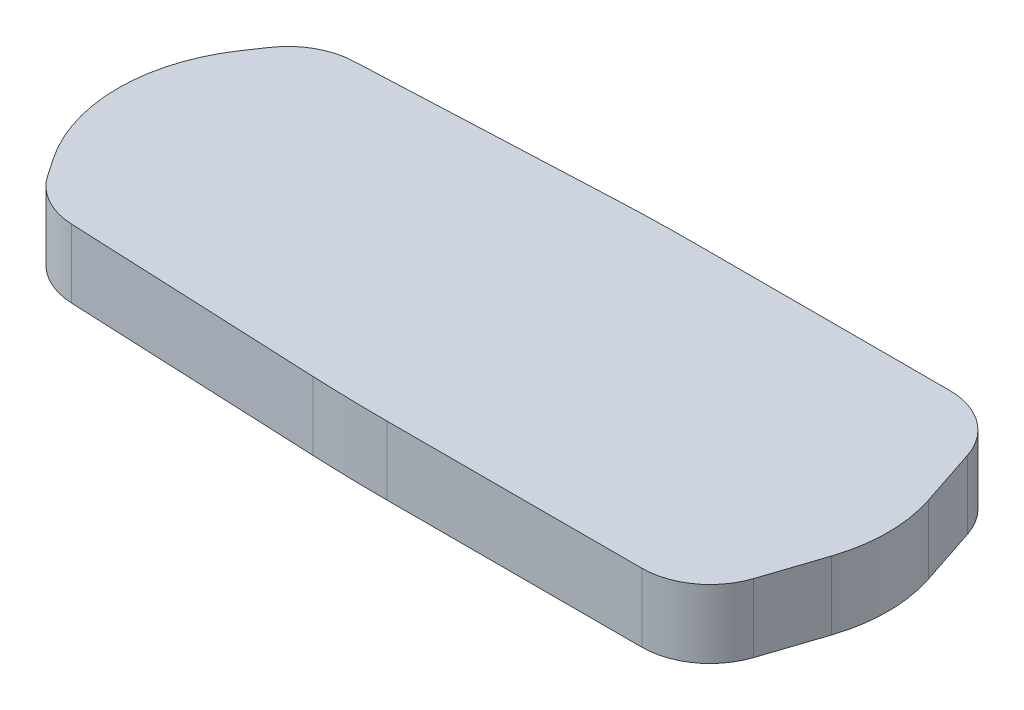
ISO-10303-21;
HEADER;
FILE_DESCRIPTION(('STEP AP214'),'2;1');
FILE_NAME('part.step','',(''),(''),'','','');
FILE_SCHEMA(('AUTOMOTIVE_DESIGN { 1 0 10303 214 1 1 1 1 }'));
ENDSEC;
DATA;
#1=APPLICATION_CONTEXT('core data for automotive mechanical design processes');
#2=APPLICATION_PROTOCOL_DEFINITION('international standard','automotive_design',2000,#1);
#3=PRODUCT_CONTEXT('',#1,'mechanical');
#4=PRODUCT('Part','Part','',(#3));
#5=PRODUCT_RELATED_PRODUCT_CATEGORY('part','',(#4));
#6=PRODUCT_DEFINITION_FORMATION('','',#4);
#7=PRODUCT_DEFINITION_CONTEXT('part definition',#1,'design');
#8=PRODUCT_DEFINITION('design','',#6,#7);
#9=PRODUCT_DEFINITION_SHAPE('','',#8);
#10=(LENGTH_UNIT() NAMED_UNIT(*) SI_UNIT(.MILLI.,.METRE.));
#11=(NAMED_UNIT(*) PLANE_ANGLE_UNIT() SI_UNIT($,.RADIAN.));
#12=(NAMED_UNIT(*) SI_UNIT($,.STERADIAN.) SOLID_ANGLE_UNIT());
#13=UNCERTAINTY_MEASURE_WITH_UNIT(LENGTH_MEASURE(1.E-05),#10,'distance_accuracy_value','');
#14=(GEOMETRIC_REPRESENTATION_CONTEXT(3) GLOBAL_UNCERTAINTY_ASSIGNED_CONTEXT((#13)) GLOBAL_UNIT_ASSIGNED_CONTEXT((#10,
#11,#12)) REPRESENTATION_CONTEXT('',''));
#15=CARTESIAN_POINT('',(0.,0.,0.));
#16=DIRECTION('',(0.,0.,1.));
#17=DIRECTION('',(1.,0.,0.));
#18=AXIS2_PLACEMENT_3D('',#15,#16,#17);
#19=CARTESIAN_POINT('',(247.211259110415,40.,910.));
#20=DIRECTION('',(0.,-1.,0.));
#21=DIRECTION('',(0.,0.,-1.));
#22=AXIS2_PLACEMENT_3D('',#19,#20,#21);
#23=CYLINDRICAL_SURFACE('',#22,1000.);
#24=CARTESIAN_POINT('',(247.211259110415,0.,910.));
#25=DIRECTION('',(0.,1.,0.));
#26=DIRECTION('',(0.,0.,1.));
#27=AXIS2_PLACEMENT_3D('',#24,#25,#26);
#28=CIRCLE('',#27,1000.);
#29=CARTESIAN_POINT('',(247.21125911042,0.,-90.));
#30=VERTEX_POINT('',#29);
#31=CARTESIAN_POINT('',(202.810645489692,0.,-89.0138064662085));
#32=VERTEX_POINT('',#31);
#33=EDGE_CURVE('E177',#30,#32,#28,.T.);
#34=ORIENTED_EDGE('',*,*,#33,.T.);
#35=DIRECTION('',(0.,-1.,0.));
#36=VECTOR('',#35,1.);
#37=CARTESIAN_POINT('',(202.810645489692,40.,-89.0138064662085));
#38=LINE('',#37,#36);
#39=CARTESIAN_POINT('',(202.810645489692,40.,-89.0138064662085));
#40=VERTEX_POINT('',#39);
#41=EDGE_CURVE('E11',#40,#32,#38,.T.);
#42=ORIENTED_EDGE('',*,*,#41,.F.);
#43=CARTESIAN_POINT('',(247.211259110415,40.,910.));
#44=DIRECTION('',(0.,1.,0.));
#45=DIRECTION('',(0.,0.,1.));
#46=AXIS2_PLACEMENT_3D('',#43,#44,#45);
#47=CIRCLE('',#46,1000.);
#48=CARTESIAN_POINT('',(247.21125911042,40.,-90.));
#49=VERTEX_POINT('',#48);
#50=EDGE_CURVE('E207',#49,#40,#47,.T.);
#51=ORIENTED_EDGE('',*,*,#50,.F.);
#52=DIRECTION('',(0.,-1.,0.));
#53=VECTOR('',#52,1.);
#54=CARTESIAN_POINT('',(247.21125911042,40.,-90.));
#55=LINE('',#54,#53);
#56=EDGE_CURVE('E173',#49,#30,#55,.T.);
#57=ORIENTED_EDGE('',*,*,#56,.T.);
#58=EDGE_LOOP('',(#34,#42,#51,#57));
#59=FACE_BOUND('',#58,.T.);
#60=ADVANCED_FACE('F33',(#59),#23,.T.);
#61=CARTESIAN_POINT('',(55.0607586994908,40.,-82.4471448310885));
#62=DIRECTION('',(0.0444006136207204,0.,0.999013806466209));
#63=DIRECTION('',(0.999013806466209,0.,-0.0444006136207204));
#64=AXIS2_PLACEMENT_3D('',#61,#62,#63);
#65=PLANE('',#64);
#66=DIRECTION('',(-0.999013806466209,0.,0.0444006136207204));
#67=VECTOR('',#66,1.);
#68=CARTESIAN_POINT('',(55.0607586994908,0.,-82.4471448310885));
#69=LINE('',#68,#67);
#70=CARTESIAN_POINT('',(55.0607586994908,0.,-82.4471448310885));
#71=VERTEX_POINT('',#70);
#72=EDGE_CURVE('E180',#32,#71,#69,.T.);
#73=ORIENTED_EDGE('',*,*,#72,.T.);
#74=DIRECTION('',(0.,-1.,0.));
#75=VECTOR('',#74,1.);
#76=CARTESIAN_POINT('',(55.0607586994908,40.,-82.4471448310885));
#77=LINE('',#76,#75);
#78=CARTESIAN_POINT('',(55.0607586994908,40.,-82.4471448310885));
#79=VERTEX_POINT('',#78);
#80=EDGE_CURVE('E41',#79,#71,#77,.T.);
#81=ORIENTED_EDGE('',*,*,#80,.F.);
#82=DIRECTION('',(-0.999013806466209,0.,0.0444006136207204));
#83=VECTOR('',#82,1.);
#84=CARTESIAN_POINT('',(55.0607586994908,40.,-82.4471448310885));
#85=LINE('',#84,#83);
#86=EDGE_CURVE('E116',#40,#79,#85,.T.);
#87=ORIENTED_EDGE('',*,*,#86,.F.);
#88=ORIENTED_EDGE('',*,*,#41,.T.);
#89=EDGE_LOOP('',(#73,#81,#87,#88));
#90=FACE_BOUND('',#89,.T.);
#91=ADVANCED_FACE('F305',(#90),#65,.F.);
#92=CARTESIAN_POINT('',(56.8367832443194,40.,-42.4865925724401));
#93=DIRECTION('',(0.,-1.,0.));
#94=DIRECTION('',(0.,0.,-1.));
#95=AXIS2_PLACEMENT_3D('',#92,#93,#94);
#96=CYLINDRICAL_SURFACE('',#95,40.);
#97=CARTESIAN_POINT('',(56.8367832443194,0.,-42.4865925724401));
#98=DIRECTION('',(0.,1.,0.));
#99=DIRECTION('',(0.,0.,-1.));
#100=AXIS2_PLACEMENT_3D('',#97,#98,#99);
#101=CIRCLE('',#100,40.);
#102=CARTESIAN_POINT('',(23.7302719471752,0.,-64.9356217214269));
#103=VERTEX_POINT('',#102);
#104=EDGE_CURVE('E182',#71,#103,#101,.T.);
#105=ORIENTED_EDGE('',*,*,#104,.T.);
#106=DIRECTION('',(0.,-1.,0.));
#107=VECTOR('',#106,1.);
#108=CARTESIAN_POINT('',(23.7302719471752,40.,-64.9356217214269));
#109=LINE('',#108,#107);
#110=CARTESIAN_POINT('',(23.7302719471752,40.,-64.9356217214269));
#111=VERTEX_POINT('',#110);
#112=EDGE_CURVE('E238',#111,#103,#109,.T.);
#113=ORIENTED_EDGE('',*,*,#112,.F.);
#114=CARTESIAN_POINT('',(56.8367832443194,40.,-42.4865925724401));
#115=DIRECTION('',(0.,1.,0.));
#116=DIRECTION('',(0.,0.,-1.));
#117=AXIS2_PLACEMENT_3D('',#114,#115,#116);
#118=CIRCLE('',#117,40.);
#119=EDGE_CURVE('E246',#79,#111,#118,.T.);
#120=ORIENTED_EDGE('',*,*,#119,.F.);
#121=ORIENTED_EDGE('',*,*,#80,.T.);
#122=EDGE_LOOP('',(#105,#113,#120,#121));
#123=FACE_BOUND('',#122,.T.);
#124=ADVANCED_FACE('F244',(#123),#96,.T.);
#125=CARTESIAN_POINT('',(16.802878713211,40.,-54.7195085506556));
#126=DIRECTION('',(0.827662782428605,0.,0.561225728724673));
#127=DIRECTION('',(0.561225728724673,0.,-0.827662782428605));
#128=AXIS2_PLACEMENT_3D('',#125,#126,#127);
#129=PLANE('',#128);
#130=DIRECTION('',(-0.561225728724673,0.,0.827662782428605));
#131=VECTOR('',#130,1.);
#132=CARTESIAN_POINT('',(16.802878713211,0.,-54.7195085506556));
#133=LINE('',#132,#131);
#134=CARTESIAN_POINT('',(16.802878713211,0.,-54.7195085506556));
#135=VERTEX_POINT('',#134);
#136=EDGE_CURVE('E184',#103,#135,#133,.T.);
#137=ORIENTED_EDGE('',*,*,#136,.T.);
#138=DIRECTION('',(0.,-1.,0.));
#139=VECTOR('',#138,1.);
#140=CARTESIAN_POINT('',(16.802878713211,40.,-54.7195085506556));
#141=LINE('',#140,#139);
#142=CARTESIAN_POINT('',(16.802878713211,40.,-54.7195085506556));
#143=VERTEX_POINT('',#142);
#144=EDGE_CURVE('E235',#143,#135,#141,.T.);
#145=ORIENTED_EDGE('',*,*,#144,.F.);
#146=DIRECTION('',(-0.561225728724673,0.,0.827662782428605));
#147=VECTOR('',#146,1.);
#148=CARTESIAN_POINT('',(16.802878713211,40.,-54.7195085506556));
#149=LINE('',#148,#147);
#150=EDGE_CURVE('E264',#111,#143,#149,.T.);
#151=ORIENTED_EDGE('',*,*,#150,.F.);
#152=ORIENTED_EDGE('',*,*,#112,.T.);
#153=EDGE_LOOP('',(#137,#145,#151,#152));
#154=FACE_BOUND('',#153,.T.);
#155=ADVANCED_FACE('F255',(#154),#129,.F.);
#156=CARTESIAN_POINT('',(97.5,40.,0.));
#157=DIRECTION('',(0.,-1.,0.));
#158=DIRECTION('',(0.,0.,-1.));
#159=AXIS2_PLACEMENT_3D('',#156,#157,#158);
#160=CYLINDRICAL_SURFACE('',#159,97.5);
#161=CARTESIAN_POINT('',(97.5,0.,0.));
#162=DIRECTION('',(0.,1.,0.));
#163=DIRECTION('',(0.,0.,1.));
#164=AXIS2_PLACEMENT_3D('',#161,#162,#163);
#165=CIRCLE('',#164,97.5);
#166=CARTESIAN_POINT('',(16.802878713211,0.,54.7195085506556));
#167=VERTEX_POINT('',#166);
#168=EDGE_CURVE('E186',#135,#167,#165,.T.);
#169=ORIENTED_EDGE('',*,*,#168,.T.);
#170=DIRECTION('',(0.,-1.,0.));
#171=VECTOR('',#170,1.);
#172=CARTESIAN_POINT('',(16.802878713211,40.,54.7195085506556));
#173=LINE('',#172,#171);
#174=CARTESIAN_POINT('',(16.802878713211,40.,54.7195085506556));
#175=VERTEX_POINT('',#174);
#176=EDGE_CURVE('E232',#175,#167,#173,.T.);
#177=ORIENTED_EDGE('',*,*,#176,.F.);
#178=CARTESIAN_POINT('',(97.5,40.,0.));
#179=DIRECTION('',(0.,1.,0.));
#180=DIRECTION('',(0.,0.,1.));
#181=AXIS2_PLACEMENT_3D('',#178,#179,#180);
#182=CIRCLE('',#181,97.5);
#183=EDGE_CURVE('E261',#143,#175,#182,.T.);
#184=ORIENTED_EDGE('',*,*,#183,.F.);
#185=ORIENTED_EDGE('',*,*,#144,.T.);
#186=EDGE_LOOP('',(#169,#177,#184,#185));
#187=FACE_BOUND('',#186,.T.);
#188=ADVANCED_FACE('F259',(#187),#160,.T.);
#189=CARTESIAN_POINT('',(16.802878713211,40.,54.7195085506556));
#190=DIRECTION('',(0.827662782428605,0.,-0.561225728724673));
#191=DIRECTION('',(-0.561225728724673,0.,-0.827662782428605));
#192=AXIS2_PLACEMENT_3D('',#189,#190,#191);
#193=PLANE('',#192);
#194=DIRECTION('',(0.561225728724673,0.,0.827662782428605));
#195=VECTOR('',#194,1.);
#196=CARTESIAN_POINT('',(16.802878713211,0.,54.7195085506556));
#197=LINE('',#196,#195);
#198=CARTESIAN_POINT('',(23.7302719471752,0.,64.9356217214269));
#199=VERTEX_POINT('',#198);
#200=EDGE_CURVE('E188',#167,#199,#197,.T.);
#201=ORIENTED_EDGE('',*,*,#200,.T.);
#202=DIRECTION('',(0.,-1.,0.));
#203=VECTOR('',#202,1.);
#204=CARTESIAN_POINT('',(23.7302719471752,40.,64.9356217214269));
#205=LINE('',#204,#203);
#206=CARTESIAN_POINT('',(23.7302719471752,40.,64.9356217214269));
#207=VERTEX_POINT('',#206);
#208=EDGE_CURVE('E229',#207,#199,#205,.T.);
#209=ORIENTED_EDGE('',*,*,#208,.F.);
#210=DIRECTION('',(0.561225728724673,0.,0.827662782428605));
#211=VECTOR('',#210,1.);
#212=CARTESIAN_POINT('',(16.802878713211,40.,54.7195085506556));
#213=LINE('',#212,#211);
#214=EDGE_CURVE('E263',#175,#207,#213,.T.);
#215=ORIENTED_EDGE('',*,*,#214,.F.);
#216=ORIENTED_EDGE('',*,*,#176,.T.);
#217=EDGE_LOOP('',(#201,#209,#215,#216));
#218=FACE_BOUND('',#217,.T.);
#219=ADVANCED_FACE('F318',(#218),#193,.F.);
#220=CARTESIAN_POINT('',(56.8367832443194,40.,42.4865925724401));
#221=DIRECTION('',(0.,-1.,0.));
#222=DIRECTION('',(0.,0.,-1.));
#223=AXIS2_PLACEMENT_3D('',#220,#221,#222);
#224=CYLINDRICAL_SURFACE('',#223,40.);
#225=CARTESIAN_POINT('',(56.8367832443194,0.,42.4865925724401));
#226=DIRECTION('',(0.,1.,0.));
#227=DIRECTION('',(0.,0.,1.));
#228=AXIS2_PLACEMENT_3D('',#225,#226,#227);
#229=CIRCLE('',#228,40.);
#230=CARTESIAN_POINT('',(55.0607586994908,0.,82.4471448310885));
#231=VERTEX_POINT('',#230);
#232=EDGE_CURVE('E190',#199,#231,#229,.T.);
#233=ORIENTED_EDGE('',*,*,#232,.T.);
#234=DIRECTION('',(0.,-1.,0.));
#235=VECTOR('',#234,1.);
#236=CARTESIAN_POINT('',(55.0607586994908,40.,82.4471448310885));
#237=LINE('',#236,#235);
#238=CARTESIAN_POINT('',(55.0607586994908,40.,82.4471448310885));
#239=VERTEX_POINT('',#238);
#240=EDGE_CURVE('E226',#239,#231,#237,.T.);
#241=ORIENTED_EDGE('',*,*,#240,.F.);
#242=CARTESIAN_POINT('',(56.8367832443194,40.,42.4865925724401));
#243=DIRECTION('',(0.,1.,0.));
#244=DIRECTION('',(0.,0.,1.));
#245=AXIS2_PLACEMENT_3D('',#242,#243,#244);
#246=CIRCLE('',#245,40.);
#247=EDGE_CURVE('E266',#207,#239,#246,.T.);
#248=ORIENTED_EDGE('',*,*,#247,.F.);
#249=ORIENTED_EDGE('',*,*,#208,.T.);
#250=EDGE_LOOP('',(#233,#241,#248,#249));
#251=FACE_BOUND('',#250,.T.);
#252=ADVANCED_FACE('F321',(#251),#224,.T.);
#253=CARTESIAN_POINT('',(55.0607586994908,40.,82.4471448310885));
#254=DIRECTION('',(0.0444006136207204,0.,-0.999013806466209));
#255=DIRECTION('',(-0.999013806466209,0.,-0.0444006136207204));
#256=AXIS2_PLACEMENT_3D('',#253,#254,#255);
#257=PLANE('',#256);
#258=DIRECTION('',(0.999013806466209,0.,0.0444006136207204));
#259=VECTOR('',#258,1.);
#260=CARTESIAN_POINT('',(55.0607586994908,0.,82.4471448310885));
#261=LINE('',#260,#259);
#262=CARTESIAN_POINT('',(202.810645489692,0.,89.0138064662086));
#263=VERTEX_POINT('',#262);
#264=EDGE_CURVE('E192',#231,#263,#261,.T.);
#265=ORIENTED_EDGE('',*,*,#264,.T.);
#266=DIRECTION('',(0.,-1.,0.));
#267=VECTOR('',#266,1.);
#268=CARTESIAN_POINT('',(202.810645489692,40.,89.0138064662086));
#269=LINE('',#268,#267);
#270=CARTESIAN_POINT('',(202.810645489692,40.,89.0138064662086));
#271=VERTEX_POINT('',#270);
#272=EDGE_CURVE('E223',#271,#263,#269,.T.);
#273=ORIENTED_EDGE('',*,*,#272,.F.);
#274=DIRECTION('',(0.999013806466209,0.,0.0444006136207204));
#275=VECTOR('',#274,1.);
#276=CARTESIAN_POINT('',(55.0607586994908,40.,82.4471448310885));
#277=LINE('',#276,#275);
#278=EDGE_CURVE('E272',#239,#271,#277,.T.);
#279=ORIENTED_EDGE('',*,*,#278,.F.);
#280=ORIENTED_EDGE('',*,*,#240,.T.);
#281=EDGE_LOOP('',(#265,#273,#279,#280));
#282=FACE_BOUND('',#281,.T.);
#283=ADVANCED_FACE('F325',(#282),#257,.F.);
#284=CARTESIAN_POINT('',(247.211259110415,40.,-910.));
#285=DIRECTION('',(0.,-1.,0.));
#286=DIRECTION('',(0.,0.,-1.));
#287=AXIS2_PLACEMENT_3D('',#284,#285,#286);
#288=CYLINDRICAL_SURFACE('',#287,1000.);
#289=CARTESIAN_POINT('',(247.211259110415,0.,-910.));
#290=DIRECTION('',(0.,1.,0.));
#291=DIRECTION('',(0.,0.,-1.));
#292=AXIS2_PLACEMENT_3D('',#289,#290,#291);
#293=CIRCLE('',#292,1000.);
#294=CARTESIAN_POINT('',(247.21125911042,0.,90.));
#295=VERTEX_POINT('',#294);
#296=EDGE_CURVE('E194',#263,#295,#293,.T.);
#297=ORIENTED_EDGE('',*,*,#296,.T.);
#298=DIRECTION('',(0.,-1.,0.));
#299=VECTOR('',#298,1.);
#300=CARTESIAN_POINT('',(247.21125911042,40.,90.));
#301=LINE('',#300,#299);
#302=CARTESIAN_POINT('',(247.21125911042,40.,90.));
#303=VERTEX_POINT('',#302);
#304=EDGE_CURVE('E220',#303,#295,#301,.T.);
#305=ORIENTED_EDGE('',*,*,#304,.F.);
#306=CARTESIAN_POINT('',(247.211259110415,40.,-910.));
#307=DIRECTION('',(0.,1.,0.));
#308=DIRECTION('',(0.,0.,-1.));
#309=AXIS2_PLACEMENT_3D('',#306,#307,#308);
#310=CIRCLE('',#309,1000.);
#311=EDGE_CURVE('E274',#271,#303,#310,.T.);
#312=ORIENTED_EDGE('',*,*,#311,.F.);
#313=ORIENTED_EDGE('',*,*,#272,.T.);
#314=EDGE_LOOP('',(#297,#305,#312,#313));
#315=FACE_BOUND('',#314,.T.);
#316=ADVANCED_FACE('F329',(#315),#288,.T.);
#317=CARTESIAN_POINT('',(247.21125911042,40.,90.));
#318=DIRECTION('',(0.,0.,-1.));
#319=DIRECTION('',(-1.,0.,0.));
#320=AXIS2_PLACEMENT_3D('',#317,#318,#319);
#321=PLANE('',#320);
#322=DIRECTION('',(1.,0.,0.));
#323=VECTOR('',#322,1.);
#324=CARTESIAN_POINT('',(247.21125911042,0.,90.));
#325=LINE('',#324,#323);
#326=CARTESIAN_POINT('',(396.111111111111,0.,90.));
#327=VERTEX_POINT('',#326);
#328=EDGE_CURVE('E196',#295,#327,#325,.T.);
#329=ORIENTED_EDGE('',*,*,#328,.T.);
#330=DIRECTION('',(0.,-1.,0.));
#331=VECTOR('',#330,1.);
#332=CARTESIAN_POINT('',(396.111111111111,40.,90.));
#333=LINE('',#332,#331);
#334=CARTESIAN_POINT('',(396.111111111111,40.,90.));
#335=VERTEX_POINT('',#334);
#336=EDGE_CURVE('E217',#335,#327,#333,.T.);
#337=ORIENTED_EDGE('',*,*,#336,.F.);
#338=DIRECTION('',(1.,0.,0.));
#339=VECTOR('',#338,1.);
#340=CARTESIAN_POINT('',(247.21125911042,40.,90.));
#341=LINE('',#340,#339);
#342=EDGE_CURVE('E276',#303,#335,#341,.T.);
#343=ORIENTED_EDGE('',*,*,#342,.F.);
#344=ORIENTED_EDGE('',*,*,#304,.T.);
#345=EDGE_LOOP('',(#329,#337,#343,#344));
#346=FACE_BOUND('',#345,.T.);
#347=ADVANCED_FACE('F333',(#346),#321,.F.);
#348=CARTESIAN_POINT('',(396.111111111111,40.,50.));
#349=DIRECTION('',(0.,-1.,0.));
#350=DIRECTION('',(0.,0.,-1.));
#351=AXIS2_PLACEMENT_3D('',#348,#349,#350);
#352=CYLINDRICAL_SURFACE('',#351,40.);
#353=CARTESIAN_POINT('',(396.111111111111,0.,50.));
#354=DIRECTION('',(0.,1.,0.));
#355=DIRECTION('',(0.,0.,1.));
#356=AXIS2_PLACEMENT_3D('',#353,#354,#355);
#357=CIRCLE('',#356,40.);
#358=CARTESIAN_POINT('',(434.082713545188,0.,62.5760649087219));
#359=VERTEX_POINT('',#358);
#360=EDGE_CURVE('E198',#327,#359,#357,.T.);
#361=ORIENTED_EDGE('',*,*,#360,.T.);
#362=DIRECTION('',(0.,-1.,0.));
#363=VECTOR('',#362,1.);
#364=CARTESIAN_POINT('',(434.082713545188,40.,62.5760649087219));
#365=LINE('',#364,#363);
#366=CARTESIAN_POINT('',(434.082713545188,40.,62.5760649087219));
#367=VERTEX_POINT('',#366);
#368=EDGE_CURVE('E214',#367,#359,#365,.T.);
#369=ORIENTED_EDGE('',*,*,#368,.F.);
#370=CARTESIAN_POINT('',(396.111111111111,40.,50.));
#371=DIRECTION('',(0.,1.,0.));
#372=DIRECTION('',(0.,0.,1.));
#373=AXIS2_PLACEMENT_3D('',#370,#371,#372);
#374=CIRCLE('',#373,40.);
#375=EDGE_CURVE('E278',#335,#367,#374,.T.);
#376=ORIENTED_EDGE('',*,*,#375,.F.);
#377=ORIENTED_EDGE('',*,*,#336,.T.);
#378=EDGE_LOOP('',(#361,#369,#376,#377));
#379=FACE_BOUND('',#378,.T.);
#380=ADVANCED_FACE('F337',(#379),#352,.T.);
#381=CARTESIAN_POINT('',(445.436105476673,40.,28.2961460446247));
#382=DIRECTION('',(-0.949290060851927,0.,-0.314401622718054));
#383=DIRECTION('',(-0.314401622718054,0.,0.949290060851927));
#384=AXIS2_PLACEMENT_3D('',#381,#382,#383);
#385=PLANE('',#384);
#386=DIRECTION('',(0.314401622718054,0.,-0.949290060851927));
#387=VECTOR('',#386,1.);
#388=CARTESIAN_POINT('',(445.436105476673,0.,28.2961460446247));
#389=LINE('',#388,#387);
#390=CARTESIAN_POINT('',(445.436105476673,0.,28.2961460446247));
#391=VERTEX_POINT('',#390);
#392=EDGE_CURVE('E200',#359,#391,#389,.T.);
#393=ORIENTED_EDGE('',*,*,#392,.T.);
#394=DIRECTION('',(0.,-1.,0.));
#395=VECTOR('',#394,1.);
#396=CARTESIAN_POINT('',(445.436105476673,40.,28.2961460446247));
#397=LINE('',#396,#395);
#398=CARTESIAN_POINT('',(445.436105476673,40.,28.2961460446247));
#399=VERTEX_POINT('',#398);
#400=EDGE_CURVE('E211',#399,#391,#397,.T.);
#401=ORIENTED_EDGE('',*,*,#400,.F.);
#402=DIRECTION('',(0.314401622718054,0.,-0.949290060851927));
#403=VECTOR('',#402,1.);
#404=CARTESIAN_POINT('',(445.436105476673,40.,28.2961460446247));
#405=LINE('',#404,#403);
#406=EDGE_CURVE('E280',#367,#399,#405,.T.);
#407=ORIENTED_EDGE('',*,*,#406,.F.);
#408=ORIENTED_EDGE('',*,*,#368,.T.);
#409=EDGE_LOOP('',(#393,#401,#407,#408));
#410=FACE_BOUND('',#409,.T.);
#411=ADVANCED_FACE('F286',(#410),#385,.F.);
#412=CARTESIAN_POINT('',(360.,40.,0.));
#413=DIRECTION('',(0.,-1.,0.));
#414=DIRECTION('',(0.,0.,-1.));
#415=AXIS2_PLACEMENT_3D('',#412,#413,#414);
#416=CYLINDRICAL_SURFACE('',#415,90.);
#417=CARTESIAN_POINT('',(360.,0.,0.));
#418=DIRECTION('',(0.,1.,0.));
#419=DIRECTION('',(0.,0.,1.));
#420=AXIS2_PLACEMENT_3D('',#417,#418,#419);
#421=CIRCLE('',#420,90.);
#422=CARTESIAN_POINT('',(445.436105476673,0.,-28.2961460446247));
#423=VERTEX_POINT('',#422);
#424=EDGE_CURVE('E202',#391,#423,#421,.T.);
#425=ORIENTED_EDGE('',*,*,#424,.T.);
#426=DIRECTION('',(0.,-1.,0.));
#427=VECTOR('',#426,1.);
#428=CARTESIAN_POINT('',(445.436105476673,40.,-28.2961460446247));
#429=LINE('',#428,#427);
#430=CARTESIAN_POINT('',(445.436105476673,40.,-28.2961460446247));
#431=VERTEX_POINT('',#430);
#432=EDGE_CURVE('E168',#431,#423,#429,.T.);
#433=ORIENTED_EDGE('',*,*,#432,.F.);
#434=CARTESIAN_POINT('',(360.,40.,0.));
#435=DIRECTION('',(0.,1.,0.));
#436=DIRECTION('',(0.,0.,1.));
#437=AXIS2_PLACEMENT_3D('',#434,#435,#436);
#438=CIRCLE('',#437,90.);
#439=EDGE_CURVE('E159',#399,#431,#438,.T.);
#440=ORIENTED_EDGE('',*,*,#439,.F.);
#441=ORIENTED_EDGE('',*,*,#400,.T.);
#442=EDGE_LOOP('',(#425,#433,#440,#441));
#443=FACE_BOUND('',#442,.T.);
#444=ADVANCED_FACE('F290',(#443),#416,.T.);
#445=CARTESIAN_POINT('',(445.436105476673,40.,-28.2961460446247));
#446=DIRECTION('',(-0.949290060851927,0.,0.314401622718054));
#447=DIRECTION('',(0.314401622718054,0.,0.949290060851927));
#448=AXIS2_PLACEMENT_3D('',#445,#446,#447);
#449=PLANE('',#448);
#450=DIRECTION('',(-0.314401622718054,0.,-0.949290060851927));
#451=VECTOR('',#450,1.);
#452=CARTESIAN_POINT('',(445.436105476673,0.,-28.2961460446247));
#453=LINE('',#452,#451);
#454=CARTESIAN_POINT('',(434.082713545188,0.,-62.5760649087219));
#455=VERTEX_POINT('',#454);
#456=EDGE_CURVE('E167',#423,#455,#453,.T.);
#457=ORIENTED_EDGE('',*,*,#456,.T.);
#458=DIRECTION('',(0.,-1.,0.));
#459=VECTOR('',#458,1.);
#460=CARTESIAN_POINT('',(434.082713545188,40.,-62.5760649087219));
#461=LINE('',#460,#459);
#462=CARTESIAN_POINT('',(434.082713545188,40.,-62.5760649087219));
#463=VERTEX_POINT('',#462);
#464=EDGE_CURVE('E164',#463,#455,#461,.T.);
#465=ORIENTED_EDGE('',*,*,#464,.F.);
#466=DIRECTION('',(-0.314401622718054,0.,-0.949290060851927));
#467=VECTOR('',#466,1.);
#468=CARTESIAN_POINT('',(445.436105476673,40.,-28.2961460446247));
#469=LINE('',#468,#467);
#470=EDGE_CURVE('E153',#431,#463,#469,.T.);
#471=ORIENTED_EDGE('',*,*,#470,.F.);
#472=ORIENTED_EDGE('',*,*,#432,.T.);
#473=EDGE_LOOP('',(#457,#465,#471,#472));
#474=FACE_BOUND('',#473,.T.);
#475=ADVANCED_FACE('F165',(#474),#449,.F.);
#476=CARTESIAN_POINT('',(396.111111111111,40.,-50.));
#477=DIRECTION('',(0.,-1.,0.));
#478=DIRECTION('',(0.,0.,-1.));
#479=AXIS2_PLACEMENT_3D('',#476,#477,#478);
#480=CYLINDRICAL_SURFACE('',#479,40.);
#481=CARTESIAN_POINT('',(396.111111111111,0.,-50.));
#482=DIRECTION('',(0.,1.,0.));
#483=DIRECTION('',(0.,0.,-1.));
#484=AXIS2_PLACEMENT_3D('',#481,#482,#483);
#485=CIRCLE('',#484,40.);
#486=CARTESIAN_POINT('',(396.111111111111,0.,-90.));
#487=VERTEX_POINT('',#486);
#488=EDGE_CURVE('E102',#455,#487,#485,.T.);
#489=ORIENTED_EDGE('',*,*,#488,.T.);
#490=DIRECTION('',(0.,-1.,0.));
#491=VECTOR('',#490,1.);
#492=CARTESIAN_POINT('',(396.111111111111,40.,-90.));
#493=LINE('',#492,#491);
#494=CARTESIAN_POINT('',(396.111111111111,40.,-90.));
#495=VERTEX_POINT('',#494);
#496=EDGE_CURVE('E169',#495,#487,#493,.T.);
#497=ORIENTED_EDGE('',*,*,#496,.F.);
#498=CARTESIAN_POINT('',(396.111111111111,40.,-50.));
#499=DIRECTION('',(0.,1.,0.));
#500=DIRECTION('',(0.,0.,-1.));
#501=AXIS2_PLACEMENT_3D('',#498,#499,#500);
#502=CIRCLE('',#501,40.);
#503=EDGE_CURVE('E157',#463,#495,#502,.T.);
#504=ORIENTED_EDGE('',*,*,#503,.F.);
#505=ORIENTED_EDGE('',*,*,#464,.T.);
#506=EDGE_LOOP('',(#489,#497,#504,#505));
#507=FACE_BOUND('',#506,.T.);
#508=ADVANCED_FACE('F171',(#507),#480,.T.);
#509=CARTESIAN_POINT('',(247.21125911042,40.,-90.));
#510=DIRECTION('',(0.,0.,1.));
#511=DIRECTION('',(1.,0.,0.));
#512=AXIS2_PLACEMENT_3D('',#509,#510,#511);
#513=PLANE('',#512);
#514=DIRECTION('',(-1.,0.,0.));
#515=VECTOR('',#514,1.);
#516=CARTESIAN_POINT('',(247.21125911042,0.,-90.));
#517=LINE('',#516,#515);
#518=EDGE_CURVE('E108',#487,#30,#517,.T.);
#519=ORIENTED_EDGE('',*,*,#518,.T.);
#520=ORIENTED_EDGE('',*,*,#56,.F.);
#521=DIRECTION('',(-1.,0.,0.));
#522=VECTOR('',#521,1.);
#523=CARTESIAN_POINT('',(247.21125911042,40.,-90.));
#524=LINE('',#523,#522);
#525=EDGE_CURVE('E49',#495,#49,#524,.T.);
#526=ORIENTED_EDGE('',*,*,#525,.F.);
#527=ORIENTED_EDGE('',*,*,#496,.T.);
#528=EDGE_LOOP('',(#519,#520,#526,#527));
#529=FACE_BOUND('',#528,.T.);
#530=ADVANCED_FACE('F294',(#529),#513,.F.);
#531=CARTESIAN_POINT('',(247.211259110415,40.,910.));
#532=DIRECTION('',(0.,1.,0.));
#533=DIRECTION('',(0.,0.,1.));
#534=AXIS2_PLACEMENT_3D('',#531,#532,#533);
#535=PLANE('',#534);
#536=ORIENTED_EDGE('',*,*,#50,.T.);
#537=ORIENTED_EDGE('',*,*,#86,.T.);
#538=ORIENTED_EDGE('',*,*,#119,.T.);
#539=ORIENTED_EDGE('',*,*,#150,.T.);
#540=ORIENTED_EDGE('',*,*,#183,.T.);
#541=ORIENTED_EDGE('',*,*,#214,.T.);
#542=ORIENTED_EDGE('',*,*,#247,.T.);
#543=ORIENTED_EDGE('',*,*,#278,.T.);
#544=ORIENTED_EDGE('',*,*,#311,.T.);
#545=ORIENTED_EDGE('',*,*,#342,.T.);
#546=ORIENTED_EDGE('',*,*,#375,.T.);
#547=ORIENTED_EDGE('',*,*,#406,.T.);
#548=ORIENTED_EDGE('',*,*,#439,.T.);
#549=ORIENTED_EDGE('',*,*,#470,.T.);
#550=ORIENTED_EDGE('',*,*,#503,.T.);
#551=ORIENTED_EDGE('',*,*,#525,.T.);
#552=EDGE_LOOP('',(#536,#537,#538,#539,#540,#541,#542,#543,#544,#545,#546,#547,#548,#549,#550,#551));
#553=FACE_BOUND('',#552,.T.);
#554=ADVANCED_FACE('F155',(#553),#535,.T.);
#555=CARTESIAN_POINT('',(247.211259110415,0.,910.));
#556=DIRECTION('',(0.,1.,0.));
#557=DIRECTION('',(0.,0.,1.));
#558=AXIS2_PLACEMENT_3D('',#555,#556,#557);
#559=PLANE('',#558);
#560=ORIENTED_EDGE('',*,*,#33,.F.);
#561=ORIENTED_EDGE('',*,*,#518,.F.);
#562=ORIENTED_EDGE('',*,*,#488,.F.);
#563=ORIENTED_EDGE('',*,*,#456,.F.);
#564=ORIENTED_EDGE('',*,*,#424,.F.);
#565=ORIENTED_EDGE('',*,*,#392,.F.);
#566=ORIENTED_EDGE('',*,*,#360,.F.);
#567=ORIENTED_EDGE('',*,*,#328,.F.);
#568=ORIENTED_EDGE('',*,*,#296,.F.);
#569=ORIENTED_EDGE('',*,*,#264,.F.);
#570=ORIENTED_EDGE('',*,*,#232,.F.);
#571=ORIENTED_EDGE('',*,*,#200,.F.);
#572=ORIENTED_EDGE('',*,*,#168,.F.);
#573=ORIENTED_EDGE('',*,*,#136,.F.);
#574=ORIENTED_EDGE('',*,*,#104,.F.);
#575=ORIENTED_EDGE('',*,*,#72,.F.);
#576=EDGE_LOOP('',(#560,#561,#562,#563,#564,#565,#566,#567,#568,#569,#570,#571,#572,#573,#574,#575));
#577=FACE_BOUND('',#576,.T.);
#578=ADVANCED_FACE('F250',(#577),#559,.F.);
#579=CLOSED_SHELL('',(#60,#91,#124,#155,#188,#219,#252,#283,#316,#347,#380,#411,#444,#475,#508,
#530,#554,#578));
#580=MANIFOLD_SOLID_BREP('B2',#579);
#581=ADVANCED_BREP_SHAPE_REPRESENTATION('',(#18,#580),#14);
#582=SHAPE_DEFINITION_REPRESENTATION(#9,#581);
ENDSEC;
END-ISO-10303-21;
